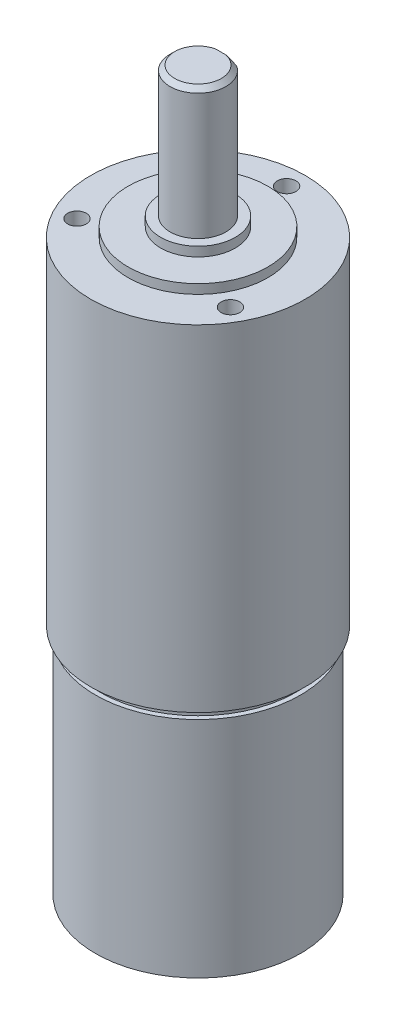
ISO-10303-21;
HEADER;
FILE_DESCRIPTION(('STEP AP214'),'2;1');
FILE_NAME('part.step','',(''),(''),'','','');
FILE_SCHEMA(('AUTOMOTIVE_DESIGN { 1 0 10303 214 1 1 1 1 }'));
ENDSEC;
DATA;
#1=APPLICATION_CONTEXT('core data for automotive mechanical design processes');
#2=APPLICATION_PROTOCOL_DEFINITION('international standard','automotive_design',2000,#1);
#3=PRODUCT_CONTEXT('',#1,'mechanical');
#4=PRODUCT('Part','Part','',(#3));
#5=PRODUCT_RELATED_PRODUCT_CATEGORY('part','',(#4));
#6=PRODUCT_DEFINITION_FORMATION('','',#4);
#7=PRODUCT_DEFINITION_CONTEXT('part definition',#1,'design');
#8=PRODUCT_DEFINITION('design','',#6,#7);
#9=PRODUCT_DEFINITION_SHAPE('','',#8);
#10=(LENGTH_UNIT() NAMED_UNIT(*) SI_UNIT(.MILLI.,.METRE.));
#11=(NAMED_UNIT(*) PLANE_ANGLE_UNIT() SI_UNIT($,.RADIAN.));
#12=(NAMED_UNIT(*) SI_UNIT($,.STERADIAN.) SOLID_ANGLE_UNIT());
#13=UNCERTAINTY_MEASURE_WITH_UNIT(LENGTH_MEASURE(1.E-05),#10,'distance_accuracy_value','');
#14=(GEOMETRIC_REPRESENTATION_CONTEXT(3) GLOBAL_UNCERTAINTY_ASSIGNED_CONTEXT((#13)) GLOBAL_UNIT_ASSIGNED_CONTEXT((#10,
#11,#12)) REPRESENTATION_CONTEXT('',''));
#15=CARTESIAN_POINT('',(0.,0.,0.));
#16=DIRECTION('',(0.,0.,1.));
#17=DIRECTION('',(1.,0.,0.));
#18=AXIS2_PLACEMENT_3D('',#15,#16,#17);
#19=CARTESIAN_POINT('',(0.,0.,0.));
#20=DIRECTION('',(0.,-1.,0.));
#21=DIRECTION('',(0.,0.,-1.));
#22=AXIS2_PLACEMENT_3D('',#19,#20,#21);
#23=PLANE('',#22);
#24=CARTESIAN_POINT('',(0.,0.,0.));
#25=DIRECTION('',(0.,-1.,0.));
#26=DIRECTION('',(0.,0.,-1.));
#27=AXIS2_PLACEMENT_3D('',#24,#25,#26);
#28=CIRCLE('',#27,7.5);
#29=CARTESIAN_POINT('',(0.,0.,-7.5));
#30=VERTEX_POINT('',#29);
#31=EDGE_CURVE('E131',#30,#30,#28,.T.);
#32=ORIENTED_EDGE('',*,*,#31,.T.);
#33=EDGE_LOOP('',(#32));
#34=FACE_BOUND('',#33,.T.);
#35=ADVANCED_FACE('F40',(#34),#23,.T.);
#36=CARTESIAN_POINT('',(0.,0.,0.));
#37=DIRECTION('',(0.,-1.,0.));
#38=DIRECTION('',(0.,0.,-1.));
#39=AXIS2_PLACEMENT_3D('',#36,#37,#38);
#40=CYLINDRICAL_SURFACE('',#39,7.5);
#41=CARTESIAN_POINT('',(0.,2.,0.));
#42=DIRECTION('',(0.,-1.,0.));
#43=DIRECTION('',(0.,0.,-1.));
#44=AXIS2_PLACEMENT_3D('',#41,#42,#43);
#45=CIRCLE('',#44,7.5);
#46=CARTESIAN_POINT('',(0.,2.,-7.5));
#47=VERTEX_POINT('',#46);
#48=EDGE_CURVE('E128',#47,#47,#45,.T.);
#49=ORIENTED_EDGE('',*,*,#48,.T.);
#50=EDGE_LOOP('',(#49));
#51=FACE_BOUND('',#50,.T.);
#52=ORIENTED_EDGE('',*,*,#31,.F.);
#53=EDGE_LOOP('',(#52));
#54=FACE_BOUND('',#53,.T.);
#55=ADVANCED_FACE('F197',(#51,#54),#40,.T.);
#56=CARTESIAN_POINT('',(7.5,2.,0.));
#57=DIRECTION('',(0.,-1.,0.));
#58=DIRECTION('',(0.,0.,-1.));
#59=AXIS2_PLACEMENT_3D('',#56,#57,#58);
#60=PLANE('',#59);
#61=CARTESIAN_POINT('',(0.,2.,0.));
#62=DIRECTION('',(0.,-1.,0.));
#63=DIRECTION('',(0.,0.,-1.));
#64=AXIS2_PLACEMENT_3D('',#61,#62,#63);
#65=CIRCLE('',#64,11.);
#66=CARTESIAN_POINT('',(0.,2.,-11.));
#67=VERTEX_POINT('',#66);
#68=EDGE_CURVE('E125',#67,#67,#65,.T.);
#69=ORIENTED_EDGE('',*,*,#68,.T.);
#70=EDGE_LOOP('',(#69));
#71=FACE_BOUND('',#70,.T.);
#72=ORIENTED_EDGE('',*,*,#48,.F.);
#73=EDGE_LOOP('',(#72));
#74=FACE_BOUND('',#73,.T.);
#75=ADVANCED_FACE('F193',(#71,#74),#60,.T.);
#76=CARTESIAN_POINT('',(0.,0.,0.));
#77=DIRECTION('',(0.,-1.,0.));
#78=DIRECTION('',(0.,0.,-1.));
#79=AXIS2_PLACEMENT_3D('',#76,#77,#78);
#80=CYLINDRICAL_SURFACE('',#79,11.);
#81=CARTESIAN_POINT('',(0.,26.,0.));
#82=DIRECTION('',(0.,-1.,0.));
#83=DIRECTION('',(0.,0.,-1.));
#84=AXIS2_PLACEMENT_3D('',#81,#82,#83);
#85=CIRCLE('',#84,11.);
#86=CARTESIAN_POINT('',(0.,26.,-11.));
#87=VERTEX_POINT('',#86);
#88=EDGE_CURVE('E122',#87,#87,#85,.T.);
#89=ORIENTED_EDGE('',*,*,#88,.T.);
#90=EDGE_LOOP('',(#89));
#91=FACE_BOUND('',#90,.T.);
#92=ORIENTED_EDGE('',*,*,#68,.F.);
#93=EDGE_LOOP('',(#92));
#94=FACE_BOUND('',#93,.T.);
#95=ADVANCED_FACE('F189',(#91,#94),#80,.T.);
#96=CARTESIAN_POINT('',(11.,26.,0.));
#97=DIRECTION('',(0.,1.,0.));
#98=DIRECTION('',(0.,0.,1.));
#99=AXIS2_PLACEMENT_3D('',#96,#97,#98);
#100=PLANE('',#99);
#101=CARTESIAN_POINT('',(0.,26.,0.));
#102=DIRECTION('',(0.,-1.,0.));
#103=DIRECTION('',(0.,0.,-1.));
#104=AXIS2_PLACEMENT_3D('',#101,#102,#103);
#105=CIRCLE('',#104,10.5);
#106=CARTESIAN_POINT('',(0.,26.,-10.5));
#107=VERTEX_POINT('',#106);
#108=EDGE_CURVE('E119',#107,#107,#105,.T.);
#109=ORIENTED_EDGE('',*,*,#108,.T.);
#110=EDGE_LOOP('',(#109));
#111=FACE_BOUND('',#110,.T.);
#112=ORIENTED_EDGE('',*,*,#88,.F.);
#113=EDGE_LOOP('',(#112));
#114=FACE_BOUND('',#113,.T.);
#115=ADVANCED_FACE('F185',(#111,#114),#100,.T.);
#116=CARTESIAN_POINT('',(0.,0.,0.));
#117=DIRECTION('',(0.,-1.,0.));
#118=DIRECTION('',(0.,0.,-1.));
#119=AXIS2_PLACEMENT_3D('',#116,#117,#118);
#120=CYLINDRICAL_SURFACE('',#119,10.5);
#121=CARTESIAN_POINT('',(0.,27.,0.));
#122=DIRECTION('',(0.,-1.,0.));
#123=DIRECTION('',(0.,0.,-1.));
#124=AXIS2_PLACEMENT_3D('',#121,#122,#123);
#125=CIRCLE('',#124,10.5);
#126=CARTESIAN_POINT('',(0.,27.,-10.5));
#127=VERTEX_POINT('',#126);
#128=EDGE_CURVE('E116',#127,#127,#125,.T.);
#129=ORIENTED_EDGE('',*,*,#128,.T.);
#130=EDGE_LOOP('',(#129));
#131=FACE_BOUND('',#130,.T.);
#132=ORIENTED_EDGE('',*,*,#108,.F.);
#133=EDGE_LOOP('',(#132));
#134=FACE_BOUND('',#133,.T.);
#135=ADVANCED_FACE('F181',(#131,#134),#120,.T.);
#136=CARTESIAN_POINT('',(10.5,27.,0.));
#137=DIRECTION('',(0.,-1.,0.));
#138=DIRECTION('',(0.,0.,-1.));
#139=AXIS2_PLACEMENT_3D('',#136,#137,#138);
#140=PLANE('',#139);
#141=CARTESIAN_POINT('',(0.,27.,0.));
#142=DIRECTION('',(0.,-1.,0.));
#143=DIRECTION('',(0.,0.,-1.));
#144=AXIS2_PLACEMENT_3D('',#141,#142,#143);
#145=CIRCLE('',#144,11.5);
#146=CARTESIAN_POINT('',(0.,27.,-11.5));
#147=VERTEX_POINT('',#146);
#148=EDGE_CURVE('E113',#147,#147,#145,.T.);
#149=ORIENTED_EDGE('',*,*,#148,.T.);
#150=EDGE_LOOP('',(#149));
#151=FACE_BOUND('',#150,.T.);
#152=ORIENTED_EDGE('',*,*,#128,.F.);
#153=EDGE_LOOP('',(#152));
#154=FACE_BOUND('',#153,.T.);
#155=ADVANCED_FACE('F177',(#151,#154),#140,.T.);
#156=CARTESIAN_POINT('',(0.,0.,0.));
#157=DIRECTION('',(0.,-1.,0.));
#158=DIRECTION('',(0.,0.,-1.));
#159=AXIS2_PLACEMENT_3D('',#156,#157,#158);
#160=CYLINDRICAL_SURFACE('',#159,11.5);
#161=CARTESIAN_POINT('',(0.,63.,0.));
#162=DIRECTION('',(0.,-1.,0.));
#163=DIRECTION('',(0.,0.,-1.));
#164=AXIS2_PLACEMENT_3D('',#161,#162,#163);
#165=CIRCLE('',#164,11.5);
#166=CARTESIAN_POINT('',(0.,63.,-11.5));
#167=VERTEX_POINT('',#166);
#168=EDGE_CURVE('E110',#167,#167,#165,.T.);
#169=ORIENTED_EDGE('',*,*,#168,.T.);
#170=EDGE_LOOP('',(#169));
#171=FACE_BOUND('',#170,.T.);
#172=ORIENTED_EDGE('',*,*,#148,.F.);
#173=EDGE_LOOP('',(#172));
#174=FACE_BOUND('',#173,.T.);
#175=ADVANCED_FACE('F173',(#171,#174),#160,.T.);
#176=CARTESIAN_POINT('',(11.5,63.,0.));
#177=DIRECTION('',(0.,1.,0.));
#178=DIRECTION('',(0.,0.,1.));
#179=AXIS2_PLACEMENT_3D('',#176,#177,#178);
#180=PLANE('',#179);
#181=CARTESIAN_POINT('',(-8.22724133595214,63.,4.75000000000004));
#182=DIRECTION('',(0.,1.,0.));
#183=DIRECTION('',(0.,0.,1.));
#184=AXIS2_PLACEMENT_3D('',#181,#182,#183);
#185=CIRCLE('',#184,1.);
#186=CARTESIAN_POINT('',(-8.22724133595214,63.,5.75000000000004));
#187=VERTEX_POINT('',#186);
#188=EDGE_CURVE('E425',#187,#187,#185,.T.);
#189=ORIENTED_EDGE('',*,*,#188,.F.);
#190=EDGE_LOOP('',(#189));
#191=FACE_BOUND('',#190,.T.);
#192=CARTESIAN_POINT('',(8.22724133595215,63.,4.75000000000004));
#193=DIRECTION('',(0.,1.,0.));
#194=DIRECTION('',(0.,0.,1.));
#195=AXIS2_PLACEMENT_3D('',#192,#193,#194);
#196=CIRCLE('',#195,1.);
#197=CARTESIAN_POINT('',(8.22724133595215,63.,5.75000000000004));
#198=VERTEX_POINT('',#197);
#199=EDGE_CURVE('E424',#198,#198,#196,.T.);
#200=ORIENTED_EDGE('',*,*,#199,.F.);
#201=EDGE_LOOP('',(#200));
#202=FACE_BOUND('',#201,.T.);
#203=CARTESIAN_POINT('',(0.,63.,-9.5));
#204=DIRECTION('',(0.,1.,0.));
#205=DIRECTION('',(0.,0.,1.));
#206=AXIS2_PLACEMENT_3D('',#203,#204,#205);
#207=CIRCLE('',#206,1.);
#208=CARTESIAN_POINT('',(0.,63.,-8.5));
#209=VERTEX_POINT('',#208);
#210=EDGE_CURVE('E434',#209,#209,#207,.T.);
#211=ORIENTED_EDGE('',*,*,#210,.F.);
#212=EDGE_LOOP('',(#211));
#213=FACE_BOUND('',#212,.T.);
#214=CARTESIAN_POINT('',(0.,63.,0.));
#215=DIRECTION('',(0.,-1.,0.));
#216=DIRECTION('',(0.,0.,-1.));
#217=AXIS2_PLACEMENT_3D('',#214,#215,#216);
#218=CIRCLE('',#217,7.5);
#219=CARTESIAN_POINT('',(0.,63.,-7.5));
#220=VERTEX_POINT('',#219);
#221=EDGE_CURVE('E107',#220,#220,#218,.T.);
#222=ORIENTED_EDGE('',*,*,#221,.T.);
#223=EDGE_LOOP('',(#222));
#224=FACE_BOUND('',#223,.T.);
#225=ORIENTED_EDGE('',*,*,#168,.F.);
#226=EDGE_LOOP('',(#225));
#227=FACE_BOUND('',#226,.T.);
#228=ADVANCED_FACE('F169',(#191,#202,#213,#224,#227),#180,.T.);
#229=CARTESIAN_POINT('',(0.,0.,0.));
#230=DIRECTION('',(0.,-1.,0.));
#231=DIRECTION('',(0.,0.,-1.));
#232=AXIS2_PLACEMENT_3D('',#229,#230,#231);
#233=CYLINDRICAL_SURFACE('',#232,7.5);
#234=CARTESIAN_POINT('',(0.,64.,0.));
#235=DIRECTION('',(0.,-1.,0.));
#236=DIRECTION('',(0.,0.,-1.));
#237=AXIS2_PLACEMENT_3D('',#234,#235,#236);
#238=CIRCLE('',#237,7.5);
#239=CARTESIAN_POINT('',(0.,64.,-7.5));
#240=VERTEX_POINT('',#239);
#241=EDGE_CURVE('E104',#240,#240,#238,.T.);
#242=ORIENTED_EDGE('',*,*,#241,.T.);
#243=EDGE_LOOP('',(#242));
#244=FACE_BOUND('',#243,.T.);
#245=ORIENTED_EDGE('',*,*,#221,.F.);
#246=EDGE_LOOP('',(#245));
#247=FACE_BOUND('',#246,.T.);
#248=ADVANCED_FACE('F165',(#244,#247),#233,.T.);
#249=CARTESIAN_POINT('',(7.5,64.,0.));
#250=DIRECTION('',(0.,1.,0.));
#251=DIRECTION('',(0.,0.,1.));
#252=AXIS2_PLACEMENT_3D('',#249,#250,#251);
#253=PLANE('',#252);
#254=CARTESIAN_POINT('',(0.,64.,0.));
#255=DIRECTION('',(0.,-1.,0.));
#256=DIRECTION('',(0.,0.,-1.));
#257=AXIS2_PLACEMENT_3D('',#254,#255,#256);
#258=CIRCLE('',#257,4.);
#259=CARTESIAN_POINT('',(0.,64.,-4.));
#260=VERTEX_POINT('',#259);
#261=EDGE_CURVE('E101',#260,#260,#258,.T.);
#262=ORIENTED_EDGE('',*,*,#261,.T.);
#263=EDGE_LOOP('',(#262));
#264=FACE_BOUND('',#263,.T.);
#265=ORIENTED_EDGE('',*,*,#241,.F.);
#266=EDGE_LOOP('',(#265));
#267=FACE_BOUND('',#266,.T.);
#268=ADVANCED_FACE('F161',(#264,#267),#253,.T.);
#269=CARTESIAN_POINT('',(0.,0.,0.));
#270=DIRECTION('',(0.,-1.,0.));
#271=DIRECTION('',(0.,0.,-1.));
#272=AXIS2_PLACEMENT_3D('',#269,#270,#271);
#273=CYLINDRICAL_SURFACE('',#272,4.);
#274=CARTESIAN_POINT('',(0.,65.,0.));
#275=DIRECTION('',(0.,-1.,0.));
#276=DIRECTION('',(0.,0.,-1.));
#277=AXIS2_PLACEMENT_3D('',#274,#275,#276);
#278=CIRCLE('',#277,4.);
#279=CARTESIAN_POINT('',(0.,65.,-4.));
#280=VERTEX_POINT('',#279);
#281=EDGE_CURVE('E98',#280,#280,#278,.T.);
#282=ORIENTED_EDGE('',*,*,#281,.T.);
#283=EDGE_LOOP('',(#282));
#284=FACE_BOUND('',#283,.T.);
#285=ORIENTED_EDGE('',*,*,#261,.F.);
#286=EDGE_LOOP('',(#285));
#287=FACE_BOUND('',#286,.T.);
#288=ADVANCED_FACE('F157',(#284,#287),#273,.T.);
#289=CARTESIAN_POINT('',(4.,65.,0.));
#290=DIRECTION('',(0.,1.,0.));
#291=DIRECTION('',(0.,0.,1.));
#292=AXIS2_PLACEMENT_3D('',#289,#290,#291);
#293=PLANE('',#292);
#294=CARTESIAN_POINT('',(0.,65.,0.));
#295=DIRECTION('',(0.,-1.,0.));
#296=DIRECTION('',(0.,0.,-1.));
#297=AXIS2_PLACEMENT_3D('',#294,#295,#296);
#298=CIRCLE('',#297,3.);
#299=CARTESIAN_POINT('',(0.,65.,-3.));
#300=VERTEX_POINT('',#299);
#301=EDGE_CURVE('E92',#300,#300,#298,.T.);
#302=ORIENTED_EDGE('',*,*,#301,.T.);
#303=EDGE_LOOP('',(#302));
#304=FACE_BOUND('',#303,.T.);
#305=ORIENTED_EDGE('',*,*,#281,.F.);
#306=EDGE_LOOP('',(#305));
#307=FACE_BOUND('',#306,.T.);
#308=ADVANCED_FACE('F154',(#304,#307),#293,.T.);
#309=CARTESIAN_POINT('',(0.,0.,0.));
#310=DIRECTION('',(0.,-1.,0.));
#311=DIRECTION('',(0.,0.,-1.));
#312=AXIS2_PLACEMENT_3D('',#309,#310,#311);
#313=CYLINDRICAL_SURFACE('',#312,3.);
#314=DIRECTION('',(0.,1.,0.));
#315=VECTOR('',#314,1.);
#316=CARTESIAN_POINT('',(1.75,69.,-2.43669858620224));
#317=LINE('',#316,#315);
#318=CARTESIAN_POINT('',(1.75,69.,-2.43669858620224));
#319=VERTEX_POINT('',#318);
#320=CARTESIAN_POINT('',(1.75,78.5,-2.43669858620224));
#321=VERTEX_POINT('',#320);
#322=EDGE_CURVE('E84',#319,#321,#317,.T.);
#323=ORIENTED_EDGE('',*,*,#322,.T.);
#324=CARTESIAN_POINT('',(0.,78.5,0.));
#325=DIRECTION('',(0.,1.,0.));
#326=DIRECTION('',(0.,0.,1.));
#327=AXIS2_PLACEMENT_3D('',#324,#325,#326);
#328=CIRCLE('',#327,3.);
#329=CARTESIAN_POINT('',(-1.75,78.5,-2.43669858620224));
#330=VERTEX_POINT('',#329);
#331=EDGE_CURVE('E90',#321,#330,#328,.F.);
#332=ORIENTED_EDGE('',*,*,#331,.T.);
#333=DIRECTION('',(0.,1.,0.));
#334=VECTOR('',#333,1.);
#335=CARTESIAN_POINT('',(-1.75,69.,-2.43669858620224));
#336=LINE('',#335,#334);
#337=CARTESIAN_POINT('',(-1.75,69.,-2.43669858620224));
#338=VERTEX_POINT('',#337);
#339=EDGE_CURVE('E83',#338,#330,#336,.T.);
#340=ORIENTED_EDGE('',*,*,#339,.F.);
#341=CARTESIAN_POINT('',(0.,69.,0.));
#342=DIRECTION('',(0.,1.,0.));
#343=DIRECTION('',(0.,0.,-1.));
#344=AXIS2_PLACEMENT_3D('',#341,#342,#343);
#345=CIRCLE('',#344,3.);
#346=EDGE_CURVE('E73',#319,#338,#345,.T.);
#347=ORIENTED_EDGE('',*,*,#346,.F.);
#348=EDGE_LOOP('',(#323,#332,#340,#347));
#349=FACE_BOUND('',#348,.T.);
#350=ORIENTED_EDGE('',*,*,#301,.F.);
#351=EDGE_LOOP('',(#350));
#352=FACE_BOUND('',#351,.T.);
#353=ADVANCED_FACE('F87',(#349,#352),#313,.T.);
#354=CARTESIAN_POINT('',(3.,79.,0.));
#355=DIRECTION('',(0.,1.,0.));
#356=DIRECTION('',(0.,0.,1.));
#357=AXIS2_PLACEMENT_3D('',#354,#355,#356);
#358=PLANE('',#357);
#359=DIRECTION('',(1.,0.,0.));
#360=VECTOR('',#359,1.);
#361=CARTESIAN_POINT('',(-1.75,79.,-2.43669858620224));
#362=LINE('',#361,#360);
#363=CARTESIAN_POINT('',(-0.559016994374891,79.,-2.43669858620224));
#364=VERTEX_POINT('',#363);
#365=CARTESIAN_POINT('',(0.559016994374891,79.,-2.43669858620224));
#366=VERTEX_POINT('',#365);
#367=EDGE_CURVE('E80',#364,#366,#362,.T.);
#368=ORIENTED_EDGE('',*,*,#367,.F.);
#369=CARTESIAN_POINT('',(0.,79.,0.));
#370=DIRECTION('',(0.,1.,0.));
#371=DIRECTION('',(0.,0.,1.));
#372=AXIS2_PLACEMENT_3D('',#369,#370,#371);
#373=CIRCLE('',#372,2.49999999999999);
#374=EDGE_CURVE('E11',#364,#366,#373,.T.);
#375=ORIENTED_EDGE('',*,*,#374,.T.);
#376=EDGE_LOOP('',(#368,#375));
#377=FACE_BOUND('',#376,.T.);
#378=ADVANCED_FACE('F147',(#377),#358,.T.);
#379=CARTESIAN_POINT('',(-1.75,69.,-2.43669858620224));
#380=DIRECTION('',(0.,0.,1.));
#381=DIRECTION('',(1.,0.,0.));
#382=AXIS2_PLACEMENT_3D('',#379,#380,#381);
#383=PLANE('',#382);
#384=ORIENTED_EDGE('',*,*,#339,.T.);
#385=CARTESIAN_POINT('',(-1.75,78.5,-2.43669858620224));
#386=CARTESIAN_POINT('',(-1.70324468496791,78.5272706518484,-2.43669858620224));
#387=CARTESIAN_POINT('',(-1.65617771427592,78.5540090130527,-2.43669858620224));
#388=CARTESIAN_POINT('',(-1.56135230749019,78.6062564519986,-2.43669858620224));
#389=CARTESIAN_POINT('',(-1.51359370605388,78.6317652292675,-2.43669858620224));
#390=CARTESIAN_POINT('',(-1.36979040150425,78.7058825831093,-2.43669858620224));
#391=CARTESIAN_POINT('',(-1.27265793627562,78.7524137383129,-2.43669858620224));
#392=CARTESIAN_POINT('',(-1.07495810415812,78.8382146636159,-2.43669858620224));
#393=CARTESIAN_POINT('',(-0.974385024013944,78.8774715846398,-2.43669858620224));
#394=CARTESIAN_POINT('',(-0.769425282191486,78.9465382444732,-2.43669858620224));
#395=CARTESIAN_POINT('',(-0.665019747363201,78.9762913529055,-2.43669858620224));
#396=CARTESIAN_POINT('',(-0.559016994374886,79.,-2.43669858620224));
#397=B_SPLINE_CURVE_WITH_KNOTS('',3,(#385,#386,#387,#388,#389,#390,#391,#392,#393,#394,#395,
#396),.UNSPECIFIED.,.F.,.F.,(4,2,2,2,2,4),(0.,0.162377461862315,0.324794404698711,
0.647677997509792,0.971126599631049,1.29646805817044),.UNSPECIFIED.);
#398=EDGE_CURVE('E49',#330,#364,#397,.T.);
#399=ORIENTED_EDGE('',*,*,#398,.T.);
#400=ORIENTED_EDGE('',*,*,#367,.T.);
#401=CARTESIAN_POINT('',(0.559016994374891,79.,-2.43669858620224));
#402=CARTESIAN_POINT('',(0.665019747363205,78.9762913529055,-2.43669858620224));
#403=CARTESIAN_POINT('',(0.769425282191489,78.9465382444732,-2.43669858620224));
#404=CARTESIAN_POINT('',(0.974385024013947,78.8774715846398,-2.43669858620224));
#405=CARTESIAN_POINT('',(1.07495810415812,78.8382146636159,-2.43669858620224));
#406=CARTESIAN_POINT('',(1.27265793627562,78.7524137383129,-2.43669858620224));
#407=CARTESIAN_POINT('',(1.36979040150425,78.7058825831093,-2.43669858620224));
#408=CARTESIAN_POINT('',(1.51359370605388,78.6317652292675,-2.43669858620224));
#409=CARTESIAN_POINT('',(1.56135230749019,78.6062564519986,-2.43669858620224));
#410=CARTESIAN_POINT('',(1.65617771427593,78.5540090130527,-2.43669858620224));
#411=CARTESIAN_POINT('',(1.70324468496792,78.5272706518484,-2.43669858620224));
#412=CARTESIAN_POINT('',(1.75,78.5,-2.43669858620224));
#413=B_SPLINE_CURVE_WITH_KNOTS('',3,(#401,#402,#403,#404,#405,#406,#407,#408,#409,#410,#411,
#412),.UNSPECIFIED.,.F.,.F.,(4,2,2,2,2,4),(0.,0.325341458539386,0.648790060660642,
0.971673653471722,1.13409059630812,1.29646805817043),.UNSPECIFIED.);
#414=EDGE_CURVE('E135',#366,#321,#413,.T.);
#415=ORIENTED_EDGE('',*,*,#414,.T.);
#416=ORIENTED_EDGE('',*,*,#322,.F.);
#417=DIRECTION('',(1.,0.,0.));
#418=VECTOR('',#417,1.);
#419=CARTESIAN_POINT('',(-1.75,69.,-2.43669858620224));
#420=LINE('',#419,#418);
#421=EDGE_CURVE('E76',#338,#319,#420,.T.);
#422=ORIENTED_EDGE('',*,*,#421,.F.);
#423=EDGE_LOOP('',(#384,#399,#400,#415,#416,#422));
#424=FACE_BOUND('',#423,.T.);
#425=ADVANCED_FACE('F82',(#424),#383,.F.);
#426=CARTESIAN_POINT('',(0.,69.,0.));
#427=DIRECTION('',(0.,-1.,0.));
#428=DIRECTION('',(0.,0.,-1.));
#429=AXIS2_PLACEMENT_3D('',#426,#427,#428);
#430=PLANE('',#429);
#431=ORIENTED_EDGE('',*,*,#346,.T.);
#432=ORIENTED_EDGE('',*,*,#421,.T.);
#433=EDGE_LOOP('',(#431,#432));
#434=FACE_BOUND('',#433,.T.);
#435=ADVANCED_FACE('F75',(#434),#430,.F.);
#436=CARTESIAN_POINT('',(0.,78.5,0.));
#437=DIRECTION('',(0.,-1.,0.));
#438=DIRECTION('',(0.,0.,-1.));
#439=AXIS2_PLACEMENT_3D('',#436,#437,#438);
#440=CONICAL_SURFACE('',#439,3.,0.785398163397432);
#441=ORIENTED_EDGE('',*,*,#414,.F.);
#442=ORIENTED_EDGE('',*,*,#374,.F.);
#443=ORIENTED_EDGE('',*,*,#398,.F.);
#444=ORIENTED_EDGE('',*,*,#331,.F.);
#445=EDGE_LOOP('',(#441,#442,#443,#444));
#446=FACE_BOUND('',#445,.T.);
#447=ADVANCED_FACE('F42',(#446),#440,.T.);
#448=CARTESIAN_POINT('',(0.,59.,-9.5));
#449=DIRECTION('',(0.,1.,0.));
#450=DIRECTION('',(0.,0.,1.));
#451=AXIS2_PLACEMENT_3D('',#448,#449,#450);
#452=CYLINDRICAL_SURFACE('',#451,1.);
#453=CARTESIAN_POINT('',(0.,59.,-9.5));
#454=DIRECTION('',(0.,1.,0.));
#455=DIRECTION('',(0.,0.,1.));
#456=AXIS2_PLACEMENT_3D('',#453,#454,#455);
#457=CIRCLE('',#456,1.);
#458=CARTESIAN_POINT('',(0.,59.,-8.5));
#459=VERTEX_POINT('',#458);
#460=EDGE_CURVE('E436',#459,#459,#457,.T.);
#461=ORIENTED_EDGE('',*,*,#460,.F.);
#462=EDGE_LOOP('',(#461));
#463=FACE_BOUND('',#462,.T.);
#464=ORIENTED_EDGE('',*,*,#210,.T.);
#465=EDGE_LOOP('',(#464));
#466=FACE_BOUND('',#465,.T.);
#467=ADVANCED_FACE('F278',(#463,#466),#452,.F.);
#468=CARTESIAN_POINT('',(0.,59.,-9.5));
#469=DIRECTION('',(0.,1.,0.));
#470=DIRECTION('',(0.,0.,1.));
#471=AXIS2_PLACEMENT_3D('',#468,#469,#470);
#472=PLANE('',#471);
#473=ORIENTED_EDGE('',*,*,#460,.T.);
#474=EDGE_LOOP('',(#473));
#475=FACE_BOUND('',#474,.T.);
#476=ADVANCED_FACE('F286',(#475),#472,.T.);
#477=CARTESIAN_POINT('',(8.22724133595215,59.,4.75000000000004));
#478=DIRECTION('',(0.,1.,0.));
#479=DIRECTION('',(0.,0.,1.));
#480=AXIS2_PLACEMENT_3D('',#477,#478,#479);
#481=CYLINDRICAL_SURFACE('',#480,1.);
#482=CARTESIAN_POINT('',(8.22724133595215,59.,4.75000000000004));
#483=DIRECTION('',(0.,1.,0.));
#484=DIRECTION('',(0.,0.,1.));
#485=AXIS2_PLACEMENT_3D('',#482,#483,#484);
#486=CIRCLE('',#485,1.);
#487=CARTESIAN_POINT('',(8.22724133595215,59.,5.75000000000004));
#488=VERTEX_POINT('',#487);
#489=EDGE_CURVE('E428',#488,#488,#486,.T.);
#490=ORIENTED_EDGE('',*,*,#489,.F.);
#491=EDGE_LOOP('',(#490));
#492=FACE_BOUND('',#491,.T.);
#493=ORIENTED_EDGE('',*,*,#199,.T.);
#494=EDGE_LOOP('',(#493));
#495=FACE_BOUND('',#494,.T.);
#496=ADVANCED_FACE('F294',(#492,#495),#481,.F.);
#497=CARTESIAN_POINT('',(8.22724133595215,59.,4.75000000000004));
#498=DIRECTION('',(0.,1.,0.));
#499=DIRECTION('',(0.,0.,1.));
#500=AXIS2_PLACEMENT_3D('',#497,#498,#499);
#501=PLANE('',#500);
#502=ORIENTED_EDGE('',*,*,#489,.T.);
#503=EDGE_LOOP('',(#502));
#504=FACE_BOUND('',#503,.T.);
#505=ADVANCED_FACE('F302',(#504),#501,.T.);
#506=CARTESIAN_POINT('',(-8.22724133595214,59.,4.75000000000004));
#507=DIRECTION('',(0.,1.,0.));
#508=DIRECTION('',(0.,0.,1.));
#509=AXIS2_PLACEMENT_3D('',#506,#507,#508);
#510=CYLINDRICAL_SURFACE('',#509,1.);
#511=CARTESIAN_POINT('',(-8.22724133595214,59.,4.75000000000004));
#512=DIRECTION('',(0.,1.,0.));
#513=DIRECTION('',(0.,0.,1.));
#514=AXIS2_PLACEMENT_3D('',#511,#512,#513);
#515=CIRCLE('',#514,1.);
#516=CARTESIAN_POINT('',(-8.22724133595214,59.,5.75000000000004));
#517=VERTEX_POINT('',#516);
#518=EDGE_CURVE('E423',#517,#517,#515,.T.);
#519=ORIENTED_EDGE('',*,*,#518,.F.);
#520=EDGE_LOOP('',(#519));
#521=FACE_BOUND('',#520,.T.);
#522=ORIENTED_EDGE('',*,*,#188,.T.);
#523=EDGE_LOOP('',(#522));
#524=FACE_BOUND('',#523,.T.);
#525=ADVANCED_FACE('F310',(#521,#524),#510,.F.);
#526=CARTESIAN_POINT('',(-8.22724133595214,59.,4.75000000000004));
#527=DIRECTION('',(0.,1.,0.));
#528=DIRECTION('',(0.,0.,1.));
#529=AXIS2_PLACEMENT_3D('',#526,#527,#528);
#530=PLANE('',#529);
#531=ORIENTED_EDGE('',*,*,#518,.T.);
#532=EDGE_LOOP('',(#531));
#533=FACE_BOUND('',#532,.T.);
#534=ADVANCED_FACE('F317',(#533),#530,.T.);
#535=CLOSED_SHELL('',(#35,#55,#75,#95,#115,#135,#155,#175,#228,#248,#268,#288,#308,#353,#378,
#425,#435,#447,#467,#476,#496,#505,#525,#534));
#536=MANIFOLD_SOLID_BREP('B2',#535);
#537=ADVANCED_BREP_SHAPE_REPRESENTATION('',(#18,#536),#14);
#538=SHAPE_DEFINITION_REPRESENTATION(#9,#537);
ENDSEC;
END-ISO-10303-21;
